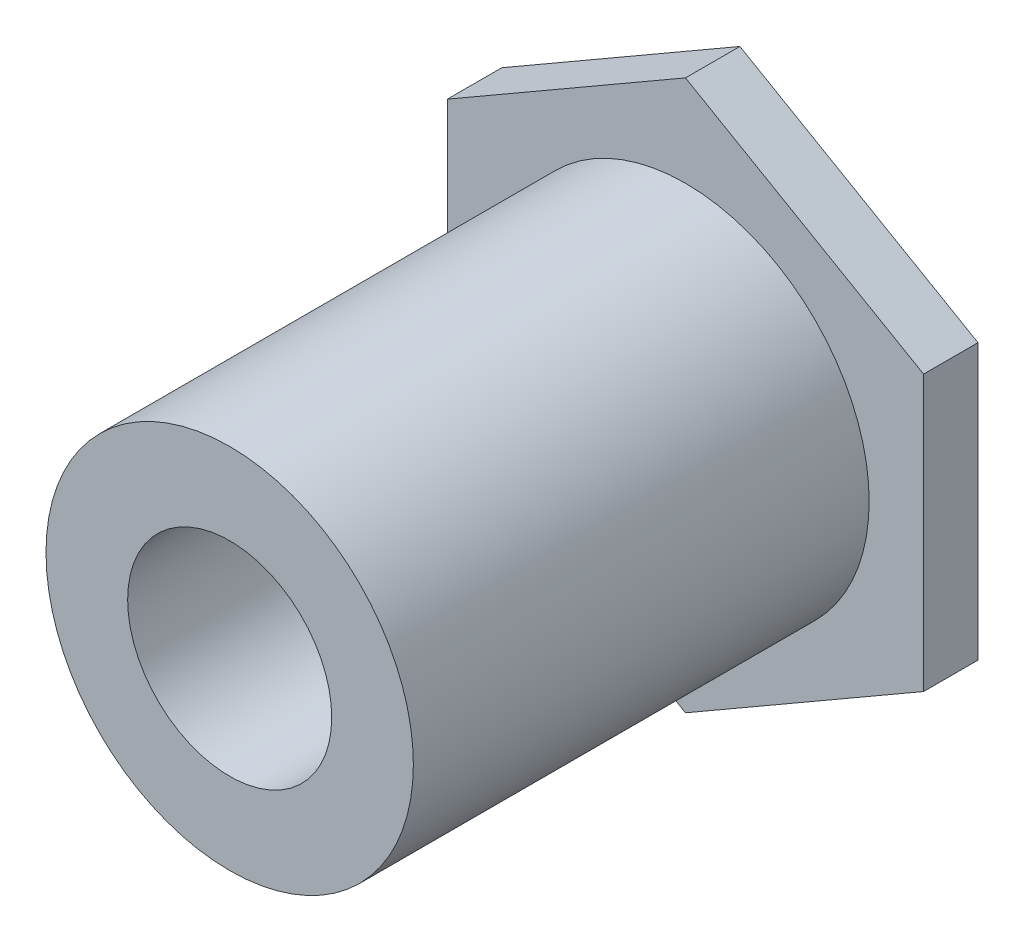
ISO-10303-21;
HEADER;
FILE_DESCRIPTION(('STEP AP214'),'2;1');
FILE_NAME('part.step','',(''),(''),'','','');
FILE_SCHEMA(('AUTOMOTIVE_DESIGN { 1 0 10303 214 1 1 1 1 }'));
ENDSEC;
DATA;
#1=APPLICATION_CONTEXT('core data for automotive mechanical design processes');
#2=APPLICATION_PROTOCOL_DEFINITION('international standard','automotive_design',2000,#1);
#3=PRODUCT_CONTEXT('',#1,'mechanical');
#4=PRODUCT('Part','Part','',(#3));
#5=PRODUCT_RELATED_PRODUCT_CATEGORY('part','',(#4));
#6=PRODUCT_DEFINITION_FORMATION('','',#4);
#7=PRODUCT_DEFINITION_CONTEXT('part definition',#1,'design');
#8=PRODUCT_DEFINITION('design','',#6,#7);
#9=PRODUCT_DEFINITION_SHAPE('','',#8);
#10=(LENGTH_UNIT() NAMED_UNIT(*) SI_UNIT(.MILLI.,.METRE.));
#11=(NAMED_UNIT(*) PLANE_ANGLE_UNIT() SI_UNIT($,.RADIAN.));
#12=(NAMED_UNIT(*) SI_UNIT($,.STERADIAN.) SOLID_ANGLE_UNIT());
#13=UNCERTAINTY_MEASURE_WITH_UNIT(LENGTH_MEASURE(1.E-05),#10,'distance_accuracy_value','');
#14=(GEOMETRIC_REPRESENTATION_CONTEXT(3) GLOBAL_UNCERTAINTY_ASSIGNED_CONTEXT((#13)) GLOBAL_UNIT_ASSIGNED_CONTEXT((#10,
#11,#12)) REPRESENTATION_CONTEXT('',''));
#15=CARTESIAN_POINT('',(0.,0.,0.));
#16=DIRECTION('',(0.,0.,1.));
#17=DIRECTION('',(1.,0.,0.));
#18=AXIS2_PLACEMENT_3D('',#15,#16,#17);
#19=CARTESIAN_POINT('',(0.,0.,0.));
#20=DIRECTION('',(0.,0.,1.));
#21=DIRECTION('',(1.,0.,0.));
#22=AXIS2_PLACEMENT_3D('',#19,#20,#21);
#23=PLANE('',#22);
#24=CARTESIAN_POINT('',(0.,0.,0.));
#25=DIRECTION('',(0.,0.,1.));
#26=DIRECTION('',(1.,0.,0.));
#27=AXIS2_PLACEMENT_3D('',#24,#25,#26);
#28=CIRCLE('',#27,1.5);
#29=CARTESIAN_POINT('',(1.5,0.,0.));
#30=VERTEX_POINT('',#29);
#31=EDGE_CURVE('E20',#30,#30,#28,.T.);
#32=ORIENTED_EDGE('',*,*,#31,.T.);
#33=EDGE_LOOP('',(#32));
#34=FACE_BOUND('',#33,.T.);
#35=DIRECTION('',(0.,1.,0.));
#36=VECTOR('',#35,1.);
#37=CARTESIAN_POINT('',(3.5,-2.020725942164,0.));
#38=LINE('',#37,#36);
#39=CARTESIAN_POINT('',(3.49999999999983,-2.02072594216371,0.));
#40=VERTEX_POINT('',#39);
#41=CARTESIAN_POINT('',(3.5,2.020725942164,0.));
#42=VERTEX_POINT('',#41);
#43=EDGE_CURVE('E125',#40,#42,#38,.T.);
#44=ORIENTED_EDGE('',*,*,#43,.F.);
#45=DIRECTION('',(0.866025403784429,0.500000000000017,0.));
#46=VECTOR('',#45,1.);
#47=CARTESIAN_POINT('',(0.,-4.041451884327,0.));
#48=LINE('',#47,#46);
#49=CARTESIAN_POINT('',(-1.68823830783149E-13,-4.04145188432729,0.));
#50=VERTEX_POINT('',#49);
#51=EDGE_CURVE('E83',#50,#40,#48,.T.);
#52=ORIENTED_EDGE('',*,*,#51,.F.);
#53=DIRECTION('',(0.866025403784429,-0.500000000000017,0.));
#54=VECTOR('',#53,1.);
#55=CARTESIAN_POINT('',(-3.5,-2.020725942164,0.));
#56=LINE('',#55,#54);
#57=CARTESIAN_POINT('',(-3.5,-2.020725942164,0.));
#58=VERTEX_POINT('',#57);
#59=EDGE_CURVE('E67',#58,#50,#56,.T.);
#60=ORIENTED_EDGE('',*,*,#59,.F.);
#61=DIRECTION('',(0.,1.,0.));
#62=VECTOR('',#61,1.);
#63=CARTESIAN_POINT('',(-3.5,2.020725942164,0.));
#64=LINE('',#63,#62);
#65=CARTESIAN_POINT('',(-3.49999999999992,2.02072594216385,0.));
#66=VERTEX_POINT('',#65);
#67=EDGE_CURVE('E72',#66,#58,#64,.F.);
#68=ORIENTED_EDGE('',*,*,#67,.F.);
#69=DIRECTION('',(-0.866025403784429,-0.500000000000017,0.));
#70=VECTOR('',#69,1.);
#71=CARTESIAN_POINT('',(0.,4.041451884327,0.));
#72=LINE('',#71,#70);
#73=CARTESIAN_POINT('',(1.69152311573718E-13,4.04145188432729,0.));
#74=VERTEX_POINT('',#73);
#75=EDGE_CURVE('E116',#74,#66,#72,.T.);
#76=ORIENTED_EDGE('',*,*,#75,.F.);
#77=DIRECTION('',(-0.866025403784429,0.500000000000017,0.));
#78=VECTOR('',#77,1.);
#79=CARTESIAN_POINT('',(3.5,2.020725942164,0.));
#80=LINE('',#79,#78);
#81=EDGE_CURVE('E120',#42,#74,#80,.T.);
#82=ORIENTED_EDGE('',*,*,#81,.F.);
#83=EDGE_LOOP('',(#44,#52,#60,#68,#76,#82));
#84=FACE_BOUND('',#83,.T.);
#85=ADVANCED_FACE('F17',(#34,#84),#23,.F.);
#86=CARTESIAN_POINT('',(-3.5,2.020725942164,0.));
#87=DIRECTION('',(-1.,0.,0.));
#88=DIRECTION('',(0.,0.,1.));
#89=AXIS2_PLACEMENT_3D('',#86,#87,#88);
#90=PLANE('',#89);
#91=DIRECTION('',(0.,0.,1.));
#92=VECTOR('',#91,1.);
#93=CARTESIAN_POINT('',(-3.49999999999966,2.02072594216341,0.));
#94=LINE('',#93,#92);
#95=CARTESIAN_POINT('',(-3.49999999999992,2.02072594216385,0.8));
#96=VERTEX_POINT('',#95);
#97=EDGE_CURVE('E77',#66,#96,#94,.T.);
#98=ORIENTED_EDGE('',*,*,#97,.F.);
#99=ORIENTED_EDGE('',*,*,#67,.T.);
#100=DIRECTION('',(0.,0.,1.));
#101=VECTOR('',#100,1.);
#102=CARTESIAN_POINT('',(-3.5,-2.020725942164,0.));
#103=LINE('',#102,#101);
#104=CARTESIAN_POINT('',(-3.5,-2.020725942164,0.8));
#105=VERTEX_POINT('',#104);
#106=EDGE_CURVE('E74',#105,#58,#103,.F.);
#107=ORIENTED_EDGE('',*,*,#106,.F.);
#108=DIRECTION('',(0.,1.,0.));
#109=VECTOR('',#108,1.);
#110=CARTESIAN_POINT('',(-3.5,0.,0.8));
#111=LINE('',#110,#109);
#112=EDGE_CURVE('E114',#96,#105,#111,.F.);
#113=ORIENTED_EDGE('',*,*,#112,.F.);
#114=EDGE_LOOP('',(#98,#99,#107,#113));
#115=FACE_BOUND('',#114,.T.);
#116=ADVANCED_FACE('F73',(#115),#90,.T.);
#117=CARTESIAN_POINT('',(-3.5,-2.020725942164,0.));
#118=DIRECTION('',(-0.500000000000017,-0.866025403784429,0.));
#119=DIRECTION('',(0.866025403784429,-0.500000000000017,0.));
#120=AXIS2_PLACEMENT_3D('',#117,#118,#119);
#121=PLANE('',#120);
#122=ORIENTED_EDGE('',*,*,#106,.T.);
#123=ORIENTED_EDGE('',*,*,#59,.T.);
#124=DIRECTION('',(0.,0.,1.));
#125=VECTOR('',#124,1.);
#126=CARTESIAN_POINT('',(0.,-4.041451884327,0.));
#127=LINE('',#126,#125);
#128=CARTESIAN_POINT('',(-1.68823830783149E-13,-4.04145188432729,0.8));
#129=VERTEX_POINT('',#128);
#130=EDGE_CURVE('E85',#129,#50,#127,.F.);
#131=ORIENTED_EDGE('',*,*,#130,.F.);
#132=DIRECTION('',(0.866025403784512,-0.499999999999872,0.));
#133=VECTOR('',#132,1.);
#134=CARTESIAN_POINT('',(-3.5,-2.020725942164,0.8));
#135=LINE('',#134,#133);
#136=EDGE_CURVE('E89',#105,#129,#135,.T.);
#137=ORIENTED_EDGE('',*,*,#136,.F.);
#138=EDGE_LOOP('',(#122,#123,#131,#137));
#139=FACE_BOUND('',#138,.T.);
#140=ADVANCED_FACE('F87',(#139),#121,.T.);
#141=CARTESIAN_POINT('',(0.,-4.041451884327,0.));
#142=DIRECTION('',(0.500000000000017,-0.866025403784429,0.));
#143=DIRECTION('',(0.866025403784429,0.500000000000017,0.));
#144=AXIS2_PLACEMENT_3D('',#141,#142,#143);
#145=PLANE('',#144);
#146=ORIENTED_EDGE('',*,*,#130,.T.);
#147=ORIENTED_EDGE('',*,*,#51,.T.);
#148=DIRECTION('',(0.,0.,-1.));
#149=VECTOR('',#148,1.);
#150=CARTESIAN_POINT('',(3.5,-2.020725942164,0.));
#151=LINE('',#150,#149);
#152=CARTESIAN_POINT('',(3.49999999999983,-2.02072594216371,0.8));
#153=VERTEX_POINT('',#152);
#154=EDGE_CURVE('E127',#153,#40,#151,.T.);
#155=ORIENTED_EDGE('',*,*,#154,.F.);
#156=DIRECTION('',(0.866025403784512,0.499999999999872,0.));
#157=VECTOR('',#156,1.);
#158=CARTESIAN_POINT('',(0.,-4.041451884327,0.8));
#159=LINE('',#158,#157);
#160=EDGE_CURVE('E110',#129,#153,#159,.T.);
#161=ORIENTED_EDGE('',*,*,#160,.F.);
#162=EDGE_LOOP('',(#146,#147,#155,#161));
#163=FACE_BOUND('',#162,.T.);
#164=ADVANCED_FACE('F132',(#163),#145,.T.);
#165=CARTESIAN_POINT('',(3.5,-2.020725942164,0.));
#166=DIRECTION('',(1.,0.,0.));
#167=DIRECTION('',(0.,0.,-1.));
#168=AXIS2_PLACEMENT_3D('',#165,#166,#167);
#169=PLANE('',#168);
#170=ORIENTED_EDGE('',*,*,#154,.T.);
#171=ORIENTED_EDGE('',*,*,#43,.T.);
#172=DIRECTION('',(0.,0.,1.));
#173=VECTOR('',#172,1.);
#174=CARTESIAN_POINT('',(3.5,2.020725942164,0.));
#175=LINE('',#174,#173);
#176=CARTESIAN_POINT('',(3.5,2.020725942164,0.8));
#177=VERTEX_POINT('',#176);
#178=EDGE_CURVE('E122',#177,#42,#175,.F.);
#179=ORIENTED_EDGE('',*,*,#178,.F.);
#180=DIRECTION('',(0.,1.,0.));
#181=VECTOR('',#180,1.);
#182=CARTESIAN_POINT('',(3.5,0.,0.8));
#183=LINE('',#182,#181);
#184=EDGE_CURVE('E105',#153,#177,#183,.T.);
#185=ORIENTED_EDGE('',*,*,#184,.F.);
#186=EDGE_LOOP('',(#170,#171,#179,#185));
#187=FACE_BOUND('',#186,.T.);
#188=ADVANCED_FACE('F140',(#187),#169,.T.);
#189=CARTESIAN_POINT('',(3.5,2.020725942164,0.));
#190=DIRECTION('',(0.500000000000017,0.866025403784429,0.));
#191=DIRECTION('',(-0.866025403784429,0.500000000000017,0.));
#192=AXIS2_PLACEMENT_3D('',#189,#190,#191);
#193=PLANE('',#192);
#194=ORIENTED_EDGE('',*,*,#178,.T.);
#195=ORIENTED_EDGE('',*,*,#81,.T.);
#196=DIRECTION('',(0.,0.,1.));
#197=VECTOR('',#196,1.);
#198=CARTESIAN_POINT('',(0.,4.041451884327,0.));
#199=LINE('',#198,#197);
#200=CARTESIAN_POINT('',(1.68823830783149E-13,4.04145188432729,0.8));
#201=VERTEX_POINT('',#200);
#202=EDGE_CURVE('E35',#201,#74,#199,.F.);
#203=ORIENTED_EDGE('',*,*,#202,.F.);
#204=DIRECTION('',(-0.866025403784512,0.499999999999872,0.));
#205=VECTOR('',#204,1.);
#206=CARTESIAN_POINT('',(3.5,2.020725942164,0.8));
#207=LINE('',#206,#205);
#208=EDGE_CURVE('E101',#177,#201,#207,.T.);
#209=ORIENTED_EDGE('',*,*,#208,.F.);
#210=EDGE_LOOP('',(#194,#195,#203,#209));
#211=FACE_BOUND('',#210,.T.);
#212=ADVANCED_FACE('F138',(#211),#193,.T.);
#213=CARTESIAN_POINT('',(0.,4.041451884327,0.));
#214=DIRECTION('',(-0.500000000000017,0.866025403784429,0.));
#215=DIRECTION('',(-0.866025403784429,-0.500000000000017,0.));
#216=AXIS2_PLACEMENT_3D('',#213,#214,#215);
#217=PLANE('',#216);
#218=ORIENTED_EDGE('',*,*,#202,.T.);
#219=ORIENTED_EDGE('',*,*,#75,.T.);
#220=ORIENTED_EDGE('',*,*,#97,.T.);
#221=DIRECTION('',(-0.866025403784512,-0.499999999999872,0.));
#222=VECTOR('',#221,1.);
#223=CARTESIAN_POINT('',(0.,4.041451884327,0.8));
#224=LINE('',#223,#222);
#225=EDGE_CURVE('E97',#201,#96,#224,.T.);
#226=ORIENTED_EDGE('',*,*,#225,.F.);
#227=EDGE_LOOP('',(#218,#219,#220,#226));
#228=FACE_BOUND('',#227,.T.);
#229=ADVANCED_FACE('F136',(#228),#217,.T.);
#230=CARTESIAN_POINT('',(0.,0.,8.5));
#231=DIRECTION('',(0.,0.,1.));
#232=DIRECTION('',(1.,0.,0.));
#233=AXIS2_PLACEMENT_3D('',#230,#231,#232);
#234=CYLINDRICAL_SURFACE('',#233,1.5);
#235=ORIENTED_EDGE('',*,*,#31,.F.);
#236=EDGE_LOOP('',(#235));
#237=FACE_BOUND('',#236,.T.);
#238=CARTESIAN_POINT('',(0.,0.,7.5));
#239=DIRECTION('',(0.,0.,1.));
#240=DIRECTION('',(1.,0.,0.));
#241=AXIS2_PLACEMENT_3D('',#238,#239,#240);
#242=CIRCLE('',#241,1.5);
#243=CARTESIAN_POINT('',(1.5,0.,7.5));
#244=VERTEX_POINT('',#243);
#245=EDGE_CURVE('E95',#244,#244,#242,.F.);
#246=ORIENTED_EDGE('',*,*,#245,.F.);
#247=EDGE_LOOP('',(#246));
#248=FACE_BOUND('',#247,.T.);
#249=ADVANCED_FACE('F163',(#237,#248),#234,.F.);
#250=CARTESIAN_POINT('',(0.,0.,0.8));
#251=DIRECTION('',(0.,0.,1.));
#252=DIRECTION('',(1.,0.,0.));
#253=AXIS2_PLACEMENT_3D('',#250,#251,#252);
#254=PLANE('',#253);
#255=CARTESIAN_POINT('',(0.,0.,0.8));
#256=DIRECTION('',(0.,0.,1.));
#257=DIRECTION('',(1.,0.,0.));
#258=AXIS2_PLACEMENT_3D('',#255,#256,#257);
#259=CIRCLE('',#258,2.7);
#260=CARTESIAN_POINT('',(2.7,0.,0.8));
#261=VERTEX_POINT('',#260);
#262=EDGE_CURVE('E26',#261,#261,#259,.T.);
#263=ORIENTED_EDGE('',*,*,#262,.F.);
#264=EDGE_LOOP('',(#263));
#265=FACE_BOUND('',#264,.T.);
#266=ORIENTED_EDGE('',*,*,#208,.T.);
#267=ORIENTED_EDGE('',*,*,#225,.T.);
#268=ORIENTED_EDGE('',*,*,#112,.T.);
#269=ORIENTED_EDGE('',*,*,#136,.T.);
#270=ORIENTED_EDGE('',*,*,#160,.T.);
#271=ORIENTED_EDGE('',*,*,#184,.T.);
#272=EDGE_LOOP('',(#266,#267,#268,#269,#270,#271));
#273=FACE_BOUND('',#272,.T.);
#274=ADVANCED_FACE('F134',(#265,#273),#254,.T.);
#275=CARTESIAN_POINT('',(0.,0.,7.5));
#276=DIRECTION('',(0.,0.,1.));
#277=DIRECTION('',(1.,0.,0.));
#278=AXIS2_PLACEMENT_3D('',#275,#276,#277);
#279=PLANE('',#278);
#280=ORIENTED_EDGE('',*,*,#245,.T.);
#281=EDGE_LOOP('',(#280));
#282=FACE_BOUND('',#281,.T.);
#283=CARTESIAN_POINT('',(0.,0.,7.5));
#284=DIRECTION('',(0.,0.,1.));
#285=DIRECTION('',(1.,0.,0.));
#286=AXIS2_PLACEMENT_3D('',#283,#284,#285);
#287=CIRCLE('',#286,2.7);
#288=CARTESIAN_POINT('',(2.7,0.,7.5));
#289=VERTEX_POINT('',#288);
#290=EDGE_CURVE('E11',#289,#289,#287,.F.);
#291=ORIENTED_EDGE('',*,*,#290,.F.);
#292=EDGE_LOOP('',(#291));
#293=FACE_BOUND('',#292,.T.);
#294=ADVANCED_FACE('F152',(#282,#293),#279,.T.);
#295=CARTESIAN_POINT('',(0.,0.,0.8));
#296=DIRECTION('',(0.,0.,1.));
#297=DIRECTION('',(1.,0.,0.));
#298=AXIS2_PLACEMENT_3D('',#295,#296,#297);
#299=CYLINDRICAL_SURFACE('',#298,2.7);
#300=ORIENTED_EDGE('',*,*,#262,.T.);
#301=EDGE_LOOP('',(#300));
#302=FACE_BOUND('',#301,.T.);
#303=ORIENTED_EDGE('',*,*,#290,.T.);
#304=EDGE_LOOP('',(#303));
#305=FACE_BOUND('',#304,.T.);
#306=ADVANCED_FACE('F150',(#302,#305),#299,.T.);
#307=CLOSED_SHELL('',(#85,#116,#140,#164,#188,#212,#229,#249,#274,#294,#306));
#308=MANIFOLD_SOLID_BREP('B1',#307);
#309=ADVANCED_BREP_SHAPE_REPRESENTATION('',(#18,#308),#14);
#310=SHAPE_DEFINITION_REPRESENTATION(#9,#309);
ENDSEC;
END-ISO-10303-21;
